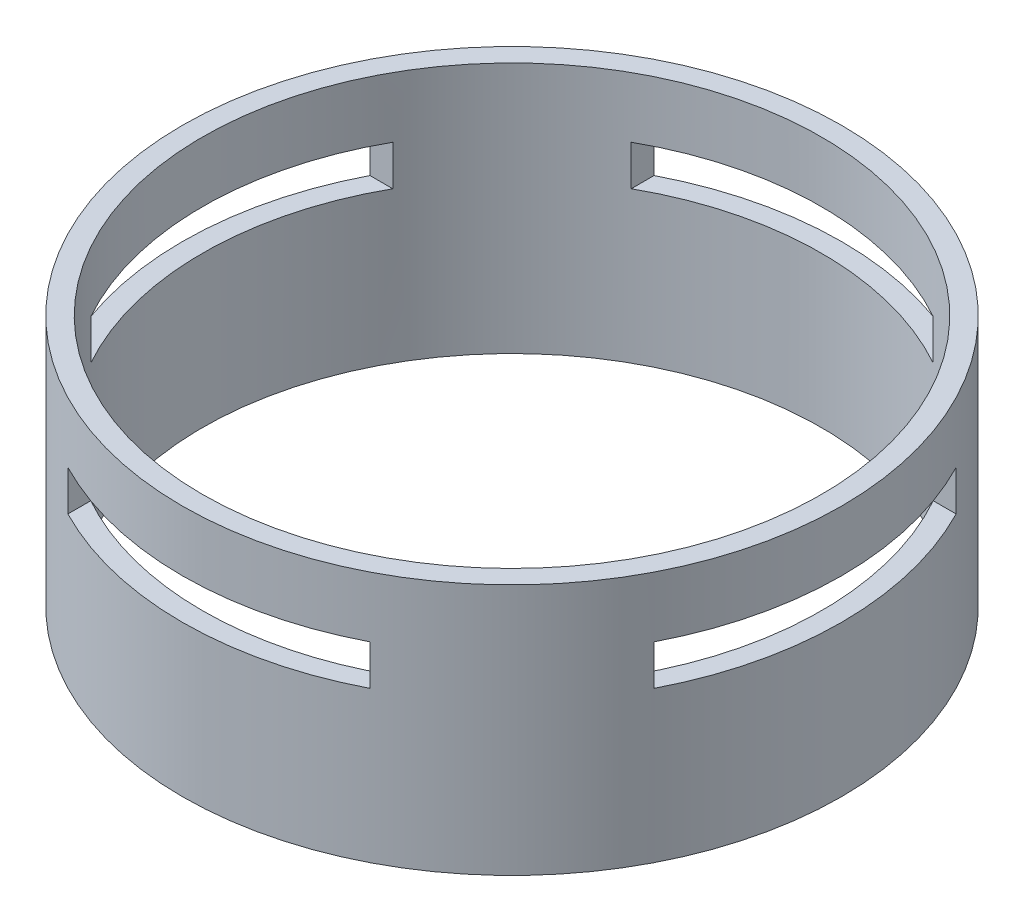
ISO-10303-21;
HEADER;
FILE_DESCRIPTION(('STEP AP214'),'2;1');
FILE_NAME('part.step','',(''),(''),'','','');
FILE_SCHEMA(('AUTOMOTIVE_DESIGN { 1 0 10303 214 1 1 1 1 }'));
ENDSEC;
DATA;
#1=APPLICATION_CONTEXT('core data for automotive mechanical design processes');
#2=APPLICATION_PROTOCOL_DEFINITION('international standard','automotive_design',2000,#1);
#3=PRODUCT_CONTEXT('',#1,'mechanical');
#4=PRODUCT('Part','Part','',(#3));
#5=PRODUCT_RELATED_PRODUCT_CATEGORY('part','',(#4));
#6=PRODUCT_DEFINITION_FORMATION('','',#4);
#7=PRODUCT_DEFINITION_CONTEXT('part definition',#1,'design');
#8=PRODUCT_DEFINITION('design','',#6,#7);
#9=PRODUCT_DEFINITION_SHAPE('','',#8);
#10=(LENGTH_UNIT() NAMED_UNIT(*) SI_UNIT(.MILLI.,.METRE.));
#11=(NAMED_UNIT(*) PLANE_ANGLE_UNIT() SI_UNIT($,.RADIAN.));
#12=(NAMED_UNIT(*) SI_UNIT($,.STERADIAN.) SOLID_ANGLE_UNIT());
#13=UNCERTAINTY_MEASURE_WITH_UNIT(LENGTH_MEASURE(1.E-05),#10,'distance_accuracy_value','');
#14=(GEOMETRIC_REPRESENTATION_CONTEXT(3) GLOBAL_UNCERTAINTY_ASSIGNED_CONTEXT((#13)) GLOBAL_UNIT_ASSIGNED_CONTEXT((#10,
#11,#12)) REPRESENTATION_CONTEXT('',''));
#15=CARTESIAN_POINT('',(0.,0.,0.));
#16=DIRECTION('',(0.,0.,1.));
#17=DIRECTION('',(1.,0.,0.));
#18=AXIS2_PLACEMENT_3D('',#15,#16,#17);
#19=CARTESIAN_POINT('',(0.,25.,0.));
#20=DIRECTION('',(0.,1.,0.));
#21=DIRECTION('',(0.,0.,1.));
#22=AXIS2_PLACEMENT_3D('',#19,#20,#21);
#23=PLANE('',#22);
#24=CARTESIAN_POINT('',(0.,25.,0.));
#25=DIRECTION('',(0.,1.,0.));
#26=DIRECTION('',(0.,0.,1.));
#27=AXIS2_PLACEMENT_3D('',#24,#25,#26);
#28=CIRCLE('',#27,32.75);
#29=CARTESIAN_POINT('',(0.,25.,32.75));
#30=VERTEX_POINT('',#29);
#31=EDGE_CURVE('E274',#30,#30,#28,.T.);
#32=ORIENTED_EDGE('',*,*,#31,.T.);
#33=EDGE_LOOP('',(#32));
#34=FACE_BOUND('',#33,.T.);
#35=CARTESIAN_POINT('',(0.,25.,0.));
#36=DIRECTION('',(0.,1.,0.));
#37=DIRECTION('',(0.,0.,1.));
#38=AXIS2_PLACEMENT_3D('',#35,#36,#37);
#39=CIRCLE('',#38,30.75);
#40=CARTESIAN_POINT('',(0.,25.,30.75));
#41=VERTEX_POINT('',#40);
#42=EDGE_CURVE('E268',#41,#41,#39,.T.);
#43=ORIENTED_EDGE('',*,*,#42,.F.);
#44=EDGE_LOOP('',(#43));
#45=FACE_BOUND('',#44,.T.);
#46=ADVANCED_FACE('F33',(#34,#45),#23,.T.);
#47=CARTESIAN_POINT('',(0.,0.,0.));
#48=DIRECTION('',(0.,1.,0.));
#49=DIRECTION('',(0.,0.,1.));
#50=AXIS2_PLACEMENT_3D('',#47,#48,#49);
#51=PLANE('',#50);
#52=CARTESIAN_POINT('',(0.,0.,0.));
#53=DIRECTION('',(0.,1.,0.));
#54=DIRECTION('',(0.,0.,1.));
#55=AXIS2_PLACEMENT_3D('',#52,#53,#54);
#56=CIRCLE('',#55,32.75);
#57=CARTESIAN_POINT('',(0.,0.,32.75));
#58=VERTEX_POINT('',#57);
#59=EDGE_CURVE('E271',#58,#58,#56,.T.);
#60=ORIENTED_EDGE('',*,*,#59,.F.);
#61=EDGE_LOOP('',(#60));
#62=FACE_BOUND('',#61,.T.);
#63=CARTESIAN_POINT('',(0.,0.,0.));
#64=DIRECTION('',(0.,1.,0.));
#65=DIRECTION('',(0.,0.,1.));
#66=AXIS2_PLACEMENT_3D('',#63,#64,#65);
#67=CIRCLE('',#66,30.75);
#68=CARTESIAN_POINT('',(0.,0.,30.75));
#69=VERTEX_POINT('',#68);
#70=EDGE_CURVE('E267',#69,#69,#67,.T.);
#71=ORIENTED_EDGE('',*,*,#70,.T.);
#72=EDGE_LOOP('',(#71));
#73=FACE_BOUND('',#72,.T.);
#74=ADVANCED_FACE('F317',(#62,#73),#51,.F.);
#75=CARTESIAN_POINT('',(0.,25.,0.));
#76=DIRECTION('',(0.,-1.,0.));
#77=DIRECTION('',(0.,0.,-1.));
#78=AXIS2_PLACEMENT_3D('',#75,#76,#77);
#79=CYLINDRICAL_SURFACE('',#78,32.75);
#80=DIRECTION('',(0.,-1.,0.));
#81=VECTOR('',#80,1.);
#82=CARTESIAN_POINT('',(29.1129266821459,25.,-14.9999999999999));
#83=LINE('',#82,#81);
#84=CARTESIAN_POINT('',(29.1129266821459,19.,-14.9999999999999));
#85=VERTEX_POINT('',#84);
#86=CARTESIAN_POINT('',(29.1129266821459,15.,-14.9999999999999));
#87=VERTEX_POINT('',#86);
#88=EDGE_CURVE('E210',#85,#87,#83,.T.);
#89=ORIENTED_EDGE('',*,*,#88,.T.);
#90=CARTESIAN_POINT('',(0.,15.,0.));
#91=DIRECTION('',(0.,-1.,0.));
#92=DIRECTION('',(0.,0.,-1.));
#93=AXIS2_PLACEMENT_3D('',#90,#91,#92);
#94=CIRCLE('',#93,32.75);
#95=CARTESIAN_POINT('',(29.1129266821458,15.,15.0000000000001));
#96=VERTEX_POINT('',#95);
#97=EDGE_CURVE('E48',#87,#96,#94,.T.);
#98=ORIENTED_EDGE('',*,*,#97,.T.);
#99=DIRECTION('',(0.,-1.,0.));
#100=VECTOR('',#99,1.);
#101=CARTESIAN_POINT('',(29.1129266821458,25.,15.0000000000001));
#102=LINE('',#101,#100);
#103=CARTESIAN_POINT('',(29.1129266821458,19.,15.0000000000001));
#104=VERTEX_POINT('',#103);
#105=EDGE_CURVE('E221',#96,#104,#102,.F.);
#106=ORIENTED_EDGE('',*,*,#105,.T.);
#107=CARTESIAN_POINT('',(0.,19.,0.));
#108=DIRECTION('',(0.,1.,0.));
#109=DIRECTION('',(0.,0.,1.));
#110=AXIS2_PLACEMENT_3D('',#107,#108,#109);
#111=CIRCLE('',#110,32.75);
#112=EDGE_CURVE('E241',#104,#85,#111,.T.);
#113=ORIENTED_EDGE('',*,*,#112,.T.);
#114=EDGE_LOOP('',(#89,#98,#106,#113));
#115=FACE_BOUND('',#114,.T.);
#116=CARTESIAN_POINT('',(-15.,19.,29.1129266821459));
#117=VERTEX_POINT('',#116);
#118=CARTESIAN_POINT('',(15.,19.,29.1129266821459));
#119=VERTEX_POINT('',#118);
#120=EDGE_CURVE('E238',#117,#119,#111,.T.);
#121=ORIENTED_EDGE('',*,*,#120,.T.);
#122=DIRECTION('',(0.,-1.,0.));
#123=VECTOR('',#122,1.);
#124=CARTESIAN_POINT('',(15.,25.,29.1129266821459));
#125=LINE('',#124,#123);
#126=CARTESIAN_POINT('',(15.,15.,29.1129266821459));
#127=VERTEX_POINT('',#126);
#128=EDGE_CURVE('E232',#119,#127,#125,.T.);
#129=ORIENTED_EDGE('',*,*,#128,.T.);
#130=CARTESIAN_POINT('',(-15.,15.,29.1129266821459));
#131=VERTEX_POINT('',#130);
#132=EDGE_CURVE('E236',#127,#131,#94,.T.);
#133=ORIENTED_EDGE('',*,*,#132,.T.);
#134=DIRECTION('',(0.,-1.,0.));
#135=VECTOR('',#134,1.);
#136=CARTESIAN_POINT('',(-15.,25.,29.1129266821459));
#137=LINE('',#136,#135);
#138=EDGE_CURVE('E229',#131,#117,#137,.F.);
#139=ORIENTED_EDGE('',*,*,#138,.T.);
#140=EDGE_LOOP('',(#121,#129,#133,#139));
#141=FACE_BOUND('',#140,.T.);
#142=DIRECTION('',(0.,-1.,0.));
#143=VECTOR('',#142,1.);
#144=CARTESIAN_POINT('',(-29.1129266821458,25.,-15.0000000000001));
#145=LINE('',#144,#143);
#146=CARTESIAN_POINT('',(-29.1129266821458,15.,-15.0000000000001));
#147=VERTEX_POINT('',#146);
#148=CARTESIAN_POINT('',(-29.1129266821458,19.,-15.0000000000001));
#149=VERTEX_POINT('',#148);
#150=EDGE_CURVE('E242',#147,#149,#145,.F.);
#151=ORIENTED_EDGE('',*,*,#150,.T.);
#152=CARTESIAN_POINT('',(-29.112926682146,19.,14.9999999999997));
#153=VERTEX_POINT('',#152);
#154=EDGE_CURVE('E240',#149,#153,#111,.T.);
#155=ORIENTED_EDGE('',*,*,#154,.T.);
#156=DIRECTION('',(0.,-1.,0.));
#157=VECTOR('',#156,1.);
#158=CARTESIAN_POINT('',(-29.112926682146,25.,14.9999999999997));
#159=LINE('',#158,#157);
#160=CARTESIAN_POINT('',(-29.112926682146,15.,14.9999999999997));
#161=VERTEX_POINT('',#160);
#162=EDGE_CURVE('E211',#153,#161,#159,.T.);
#163=ORIENTED_EDGE('',*,*,#162,.T.);
#164=EDGE_CURVE('E166',#161,#147,#94,.T.);
#165=ORIENTED_EDGE('',*,*,#164,.T.);
#166=EDGE_LOOP('',(#151,#155,#163,#165));
#167=FACE_BOUND('',#166,.T.);
#168=DIRECTION('',(0.,-1.,0.));
#169=VECTOR('',#168,1.);
#170=CARTESIAN_POINT('',(15.,25.,-29.1129266821459));
#171=LINE('',#170,#169);
#172=CARTESIAN_POINT('',(15.,15.,-29.1129266821459));
#173=VERTEX_POINT('',#172);
#174=CARTESIAN_POINT('',(15.,19.,-29.1129266821459));
#175=VERTEX_POINT('',#174);
#176=EDGE_CURVE('E259',#173,#175,#171,.F.);
#177=ORIENTED_EDGE('',*,*,#176,.T.);
#178=CARTESIAN_POINT('',(0.,19.,0.));
#179=DIRECTION('',(0.,1.,0.));
#180=DIRECTION('',(-1.,0.,0.));
#181=AXIS2_PLACEMENT_3D('',#178,#179,#180);
#182=CIRCLE('',#181,32.75);
#183=CARTESIAN_POINT('',(-15.,19.,-29.1129266821459));
#184=VERTEX_POINT('',#183);
#185=EDGE_CURVE('E262',#175,#184,#182,.T.);
#186=ORIENTED_EDGE('',*,*,#185,.T.);
#187=DIRECTION('',(0.,-1.,0.));
#188=VECTOR('',#187,1.);
#189=CARTESIAN_POINT('',(-15.,25.,-29.1129266821459));
#190=LINE('',#189,#188);
#191=CARTESIAN_POINT('',(-15.,15.,-29.1129266821459));
#192=VERTEX_POINT('',#191);
#193=EDGE_CURVE('E264',#184,#192,#190,.T.);
#194=ORIENTED_EDGE('',*,*,#193,.T.);
#195=CARTESIAN_POINT('',(0.,15.,0.));
#196=DIRECTION('',(0.,-1.,0.));
#197=DIRECTION('',(0.,0.,-1.));
#198=AXIS2_PLACEMENT_3D('',#195,#196,#197);
#199=CIRCLE('',#198,32.75);
#200=EDGE_CURVE('E250',#192,#173,#199,.T.);
#201=ORIENTED_EDGE('',*,*,#200,.T.);
#202=EDGE_LOOP('',(#177,#186,#194,#201));
#203=FACE_BOUND('',#202,.T.);
#204=ORIENTED_EDGE('',*,*,#31,.F.);
#205=EDGE_LOOP('',(#204));
#206=FACE_BOUND('',#205,.T.);
#207=ORIENTED_EDGE('',*,*,#59,.T.);
#208=EDGE_LOOP('',(#207));
#209=FACE_BOUND('',#208,.T.);
#210=ADVANCED_FACE('F35',(#115,#141,#167,#203,#206,#209),#79,.T.);
#211=CARTESIAN_POINT('',(0.,25.,0.));
#212=DIRECTION('',(0.,-1.,0.));
#213=DIRECTION('',(0.,0.,-1.));
#214=AXIS2_PLACEMENT_3D('',#211,#212,#213);
#215=CYLINDRICAL_SURFACE('',#214,30.75);
#216=DIRECTION('',(0.,-1.,0.));
#217=VECTOR('',#216,1.);
#218=CARTESIAN_POINT('',(26.84329525226,25.,-14.9999999999999));
#219=LINE('',#218,#217);
#220=CARTESIAN_POINT('',(26.84329525226,19.,-14.9999999999999));
#221=VERTEX_POINT('',#220);
#222=CARTESIAN_POINT('',(26.84329525226,15.,-14.9999999999999));
#223=VERTEX_POINT('',#222);
#224=EDGE_CURVE('E11',#221,#223,#219,.T.);
#225=ORIENTED_EDGE('',*,*,#224,.F.);
#226=CARTESIAN_POINT('',(0.,19.,0.));
#227=DIRECTION('',(0.,1.,0.));
#228=DIRECTION('',(0.,0.,1.));
#229=AXIS2_PLACEMENT_3D('',#226,#227,#228);
#230=CIRCLE('',#229,30.75);
#231=CARTESIAN_POINT('',(26.8432952522599,19.,15.0000000000001));
#232=VERTEX_POINT('',#231);
#233=EDGE_CURVE('E41',#232,#221,#230,.T.);
#234=ORIENTED_EDGE('',*,*,#233,.F.);
#235=DIRECTION('',(0.,-1.,0.));
#236=VECTOR('',#235,1.);
#237=CARTESIAN_POINT('',(26.8432952522599,25.,15.0000000000001));
#238=LINE('',#237,#236);
#239=CARTESIAN_POINT('',(26.8432952522599,15.,15.0000000000001));
#240=VERTEX_POINT('',#239);
#241=EDGE_CURVE('E179',#240,#232,#238,.F.);
#242=ORIENTED_EDGE('',*,*,#241,.F.);
#243=CARTESIAN_POINT('',(0.,15.,0.));
#244=DIRECTION('',(0.,-1.,0.));
#245=DIRECTION('',(0.,0.,-1.));
#246=AXIS2_PLACEMENT_3D('',#243,#244,#245);
#247=CIRCLE('',#246,30.75);
#248=EDGE_CURVE('E175',#223,#240,#247,.T.);
#249=ORIENTED_EDGE('',*,*,#248,.F.);
#250=EDGE_LOOP('',(#225,#234,#242,#249));
#251=FACE_BOUND('',#250,.T.);
#252=DIRECTION('',(0.,-1.,0.));
#253=VECTOR('',#252,1.);
#254=CARTESIAN_POINT('',(15.,25.,26.8432952522599));
#255=LINE('',#254,#253);
#256=CARTESIAN_POINT('',(15.,19.,26.8432952522599));
#257=VERTEX_POINT('',#256);
#258=CARTESIAN_POINT('',(15.,15.,26.8432952522599));
#259=VERTEX_POINT('',#258);
#260=EDGE_CURVE('E180',#257,#259,#255,.T.);
#261=ORIENTED_EDGE('',*,*,#260,.F.);
#262=CARTESIAN_POINT('',(-15.,19.,26.8432952522599));
#263=VERTEX_POINT('',#262);
#264=EDGE_CURVE('E178',#263,#257,#230,.T.);
#265=ORIENTED_EDGE('',*,*,#264,.F.);
#266=DIRECTION('',(0.,-1.,0.));
#267=VECTOR('',#266,1.);
#268=CARTESIAN_POINT('',(-15.,25.,26.8432952522599));
#269=LINE('',#268,#267);
#270=CARTESIAN_POINT('',(-15.,15.,26.8432952522599));
#271=VERTEX_POINT('',#270);
#272=EDGE_CURVE('E182',#271,#263,#269,.F.);
#273=ORIENTED_EDGE('',*,*,#272,.F.);
#274=EDGE_CURVE('E176',#259,#271,#247,.T.);
#275=ORIENTED_EDGE('',*,*,#274,.F.);
#276=EDGE_LOOP('',(#261,#265,#273,#275));
#277=FACE_BOUND('',#276,.T.);
#278=DIRECTION('',(0.,-1.,0.));
#279=VECTOR('',#278,1.);
#280=CARTESIAN_POINT('',(-26.8432952522599,25.,-15.0000000000001));
#281=LINE('',#280,#279);
#282=CARTESIAN_POINT('',(-26.8432952522599,15.,-15.0000000000001));
#283=VERTEX_POINT('',#282);
#284=CARTESIAN_POINT('',(-26.8432952522599,19.,-15.0000000000001));
#285=VERTEX_POINT('',#284);
#286=EDGE_CURVE('E172',#283,#285,#281,.F.);
#287=ORIENTED_EDGE('',*,*,#286,.F.);
#288=CARTESIAN_POINT('',(-26.8432952522601,15.,14.9999999999997));
#289=VERTEX_POINT('',#288);
#290=EDGE_CURVE('E159',#289,#283,#247,.T.);
#291=ORIENTED_EDGE('',*,*,#290,.F.);
#292=DIRECTION('',(0.,-1.,0.));
#293=VECTOR('',#292,1.);
#294=CARTESIAN_POINT('',(-26.8432952522601,25.,14.9999999999997));
#295=LINE('',#294,#293);
#296=CARTESIAN_POINT('',(-26.8432952522601,19.,14.9999999999997));
#297=VERTEX_POINT('',#296);
#298=EDGE_CURVE('E147',#297,#289,#295,.T.);
#299=ORIENTED_EDGE('',*,*,#298,.F.);
#300=EDGE_CURVE('E173',#285,#297,#230,.T.);
#301=ORIENTED_EDGE('',*,*,#300,.F.);
#302=EDGE_LOOP('',(#287,#291,#299,#301));
#303=FACE_BOUND('',#302,.T.);
#304=DIRECTION('',(0.,-1.,0.));
#305=VECTOR('',#304,1.);
#306=CARTESIAN_POINT('',(-15.,25.,-26.8432952522599));
#307=LINE('',#306,#305);
#308=CARTESIAN_POINT('',(-15.,19.,-26.8432952522599));
#309=VERTEX_POINT('',#308);
#310=CARTESIAN_POINT('',(-15.,15.,-26.8432952522599));
#311=VERTEX_POINT('',#310);
#312=EDGE_CURVE('E160',#309,#311,#307,.T.);
#313=ORIENTED_EDGE('',*,*,#312,.F.);
#314=CARTESIAN_POINT('',(0.,19.,0.));
#315=DIRECTION('',(0.,1.,0.));
#316=DIRECTION('',(-1.,0.,0.));
#317=AXIS2_PLACEMENT_3D('',#314,#315,#316);
#318=CIRCLE('',#317,30.75);
#319=CARTESIAN_POINT('',(15.,19.,-26.8432952522599));
#320=VERTEX_POINT('',#319);
#321=EDGE_CURVE('E283',#320,#309,#318,.T.);
#322=ORIENTED_EDGE('',*,*,#321,.F.);
#323=DIRECTION('',(0.,-1.,0.));
#324=VECTOR('',#323,1.);
#325=CARTESIAN_POINT('',(15.,25.,-26.8432952522599));
#326=LINE('',#325,#324);
#327=CARTESIAN_POINT('',(15.,15.,-26.8432952522599));
#328=VERTEX_POINT('',#327);
#329=EDGE_CURVE('E281',#328,#320,#326,.F.);
#330=ORIENTED_EDGE('',*,*,#329,.F.);
#331=CARTESIAN_POINT('',(0.,15.,0.));
#332=DIRECTION('',(0.,-1.,0.));
#333=DIRECTION('',(0.,0.,-1.));
#334=AXIS2_PLACEMENT_3D('',#331,#332,#333);
#335=CIRCLE('',#334,30.75);
#336=EDGE_CURVE('E277',#311,#328,#335,.T.);
#337=ORIENTED_EDGE('',*,*,#336,.F.);
#338=EDGE_LOOP('',(#313,#322,#330,#337));
#339=FACE_BOUND('',#338,.T.);
#340=ORIENTED_EDGE('',*,*,#42,.T.);
#341=EDGE_LOOP('',(#340));
#342=FACE_BOUND('',#341,.T.);
#343=ORIENTED_EDGE('',*,*,#70,.F.);
#344=EDGE_LOOP('',(#343));
#345=FACE_BOUND('',#344,.T.);
#346=ADVANCED_FACE('F170',(#251,#277,#303,#339,#342,#345),#215,.F.);
#347=CARTESIAN_POINT('',(-15.,19.,-32.75));
#348=DIRECTION('',(-1.,0.,0.));
#349=DIRECTION('',(0.,0.,1.));
#350=AXIS2_PLACEMENT_3D('',#347,#348,#349);
#351=PLANE('',#350);
#352=DIRECTION('',(0.,0.,1.));
#353=VECTOR('',#352,1.);
#354=CARTESIAN_POINT('',(-15.,19.,-32.75));
#355=LINE('',#354,#353);
#356=EDGE_CURVE('E247',#184,#309,#355,.T.);
#357=ORIENTED_EDGE('',*,*,#356,.T.);
#358=ORIENTED_EDGE('',*,*,#312,.T.);
#359=DIRECTION('',(0.,0.,1.));
#360=VECTOR('',#359,1.);
#361=CARTESIAN_POINT('',(-15.,15.,-32.75));
#362=LINE('',#361,#360);
#363=EDGE_CURVE('E246',#192,#311,#362,.T.);
#364=ORIENTED_EDGE('',*,*,#363,.F.);
#365=ORIENTED_EDGE('',*,*,#193,.F.);
#366=EDGE_LOOP('',(#357,#358,#364,#365));
#367=FACE_BOUND('',#366,.T.);
#368=ADVANCED_FACE('F290',(#367),#351,.F.);
#369=CARTESIAN_POINT('',(-15.,19.,-32.75));
#370=DIRECTION('',(0.,1.,0.));
#371=DIRECTION('',(-1.,0.,0.));
#372=AXIS2_PLACEMENT_3D('',#369,#370,#371);
#373=PLANE('',#372);
#374=DIRECTION('',(0.,0.,1.));
#375=VECTOR('',#374,1.);
#376=CARTESIAN_POINT('',(15.,19.,-32.75));
#377=LINE('',#376,#375);
#378=EDGE_CURVE('E251',#175,#320,#377,.T.);
#379=ORIENTED_EDGE('',*,*,#378,.T.);
#380=ORIENTED_EDGE('',*,*,#321,.T.);
#381=ORIENTED_EDGE('',*,*,#356,.F.);
#382=ORIENTED_EDGE('',*,*,#185,.F.);
#383=EDGE_LOOP('',(#379,#380,#381,#382));
#384=FACE_BOUND('',#383,.T.);
#385=ADVANCED_FACE('F306',(#384),#373,.F.);
#386=CARTESIAN_POINT('',(15.,19.,-32.75));
#387=DIRECTION('',(1.,0.,0.));
#388=DIRECTION('',(0.,1.,0.));
#389=AXIS2_PLACEMENT_3D('',#386,#387,#388);
#390=PLANE('',#389);
#391=DIRECTION('',(0.,0.,1.));
#392=VECTOR('',#391,1.);
#393=CARTESIAN_POINT('',(15.,15.,-32.75));
#394=LINE('',#393,#392);
#395=EDGE_CURVE('E254',#173,#328,#394,.T.);
#396=ORIENTED_EDGE('',*,*,#395,.T.);
#397=ORIENTED_EDGE('',*,*,#329,.T.);
#398=ORIENTED_EDGE('',*,*,#378,.F.);
#399=ORIENTED_EDGE('',*,*,#176,.F.);
#400=EDGE_LOOP('',(#396,#397,#398,#399));
#401=FACE_BOUND('',#400,.T.);
#402=ADVANCED_FACE('F301',(#401),#390,.F.);
#403=CARTESIAN_POINT('',(-15.,15.,-32.75));
#404=DIRECTION('',(0.,-1.,0.));
#405=DIRECTION('',(0.,0.,-1.));
#406=AXIS2_PLACEMENT_3D('',#403,#404,#405);
#407=PLANE('',#406);
#408=ORIENTED_EDGE('',*,*,#200,.F.);
#409=ORIENTED_EDGE('',*,*,#363,.T.);
#410=ORIENTED_EDGE('',*,*,#336,.T.);
#411=ORIENTED_EDGE('',*,*,#395,.F.);
#412=EDGE_LOOP('',(#408,#409,#410,#411));
#413=FACE_BOUND('',#412,.T.);
#414=ADVANCED_FACE('F298',(#413),#407,.F.);
#415=CARTESIAN_POINT('',(-32.7500000000005,19.,14.9999999999997));
#416=DIRECTION('',(0.,0.,1.));
#417=DIRECTION('',(1.,0.,0.));
#418=AXIS2_PLACEMENT_3D('',#415,#416,#417);
#419=PLANE('',#418);
#420=DIRECTION('',(1.,0.,0.));
#421=VECTOR('',#420,1.);
#422=CARTESIAN_POINT('',(-32.7500000000005,19.,14.9999999999997));
#423=LINE('',#422,#421);
#424=EDGE_CURVE('E154',#153,#297,#423,.T.);
#425=ORIENTED_EDGE('',*,*,#424,.T.);
#426=ORIENTED_EDGE('',*,*,#298,.T.);
#427=DIRECTION('',(1.,0.,0.));
#428=VECTOR('',#427,1.);
#429=CARTESIAN_POINT('',(-32.7500000000005,15.,14.9999999999997));
#430=LINE('',#429,#428);
#431=EDGE_CURVE('E151',#161,#289,#430,.T.);
#432=ORIENTED_EDGE('',*,*,#431,.F.);
#433=ORIENTED_EDGE('',*,*,#162,.F.);
#434=EDGE_LOOP('',(#425,#426,#432,#433));
#435=FACE_BOUND('',#434,.T.);
#436=ADVANCED_FACE('F149',(#435),#419,.F.);
#437=CARTESIAN_POINT('',(32.7500000000002,15.,-14.9999999999999));
#438=DIRECTION('',(0.,-1.,0.));
#439=DIRECTION('',(0.,0.,-1.));
#440=AXIS2_PLACEMENT_3D('',#437,#438,#439);
#441=PLANE('',#440);
#442=ORIENTED_EDGE('',*,*,#431,.T.);
#443=ORIENTED_EDGE('',*,*,#290,.T.);
#444=DIRECTION('',(-1.,0.,0.));
#445=VECTOR('',#444,1.);
#446=CARTESIAN_POINT('',(32.7500000000002,15.,-14.9999999999999));
#447=LINE('',#446,#445);
#448=EDGE_CURVE('E224',#283,#147,#447,.T.);
#449=ORIENTED_EDGE('',*,*,#448,.T.);
#450=ORIENTED_EDGE('',*,*,#164,.F.);
#451=EDGE_LOOP('',(#442,#443,#449,#450));
#452=FACE_BOUND('',#451,.T.);
#453=ADVANCED_FACE('F163',(#452),#441,.F.);
#454=CARTESIAN_POINT('',(32.7500000000002,19.,-14.9999999999999));
#455=DIRECTION('',(0.,1.,0.));
#456=DIRECTION('',(0.,0.,1.));
#457=AXIS2_PLACEMENT_3D('',#454,#455,#456);
#458=PLANE('',#457);
#459=DIRECTION('',(-1.,0.,0.));
#460=VECTOR('',#459,1.);
#461=CARTESIAN_POINT('',(32.7500000000002,19.,-14.9999999999999));
#462=LINE('',#461,#460);
#463=EDGE_CURVE('E212',#285,#149,#462,.T.);
#464=ORIENTED_EDGE('',*,*,#463,.F.);
#465=ORIENTED_EDGE('',*,*,#300,.T.);
#466=ORIENTED_EDGE('',*,*,#424,.F.);
#467=ORIENTED_EDGE('',*,*,#154,.F.);
#468=EDGE_LOOP('',(#464,#465,#466,#467));
#469=FACE_BOUND('',#468,.T.);
#470=ADVANCED_FACE('F336',(#469),#458,.F.);
#471=CARTESIAN_POINT('',(32.7500000000002,19.,-14.9999999999999));
#472=DIRECTION('',(0.,0.,-1.));
#473=DIRECTION('',(-1.,0.,0.));
#474=AXIS2_PLACEMENT_3D('',#471,#472,#473);
#475=PLANE('',#474);
#476=ORIENTED_EDGE('',*,*,#448,.F.);
#477=ORIENTED_EDGE('',*,*,#286,.T.);
#478=ORIENTED_EDGE('',*,*,#463,.T.);
#479=ORIENTED_EDGE('',*,*,#150,.F.);
#480=EDGE_LOOP('',(#476,#477,#478,#479));
#481=FACE_BOUND('',#480,.T.);
#482=ADVANCED_FACE('F344',(#481),#475,.F.);
#483=CARTESIAN_POINT('',(-15.,19.,32.75));
#484=DIRECTION('',(-1.,0.,0.));
#485=DIRECTION('',(0.,-1.,0.));
#486=AXIS2_PLACEMENT_3D('',#483,#484,#485);
#487=PLANE('',#486);
#488=DIRECTION('',(0.,0.,-1.));
#489=VECTOR('',#488,1.);
#490=CARTESIAN_POINT('',(-15.,15.,32.75));
#491=LINE('',#490,#489);
#492=EDGE_CURVE('E371',#131,#271,#491,.T.);
#493=ORIENTED_EDGE('',*,*,#492,.T.);
#494=ORIENTED_EDGE('',*,*,#272,.T.);
#495=DIRECTION('',(0.,0.,-1.));
#496=VECTOR('',#495,1.);
#497=CARTESIAN_POINT('',(-15.,19.,32.75));
#498=LINE('',#497,#496);
#499=EDGE_CURVE('E56',#117,#263,#498,.T.);
#500=ORIENTED_EDGE('',*,*,#499,.F.);
#501=ORIENTED_EDGE('',*,*,#138,.F.);
#502=EDGE_LOOP('',(#493,#494,#500,#501));
#503=FACE_BOUND('',#502,.T.);
#504=ADVANCED_FACE('F340',(#503),#487,.F.);
#505=CARTESIAN_POINT('',(15.,19.,32.75));
#506=DIRECTION('',(1.,0.,0.));
#507=DIRECTION('',(0.,0.,-1.));
#508=AXIS2_PLACEMENT_3D('',#505,#506,#507);
#509=PLANE('',#508);
#510=DIRECTION('',(0.,0.,-1.));
#511=VECTOR('',#510,1.);
#512=CARTESIAN_POINT('',(15.,19.,32.75));
#513=LINE('',#512,#511);
#514=EDGE_CURVE('E227',#119,#257,#513,.T.);
#515=ORIENTED_EDGE('',*,*,#514,.T.);
#516=ORIENTED_EDGE('',*,*,#260,.T.);
#517=DIRECTION('',(0.,0.,-1.));
#518=VECTOR('',#517,1.);
#519=CARTESIAN_POINT('',(15.,15.,32.75));
#520=LINE('',#519,#518);
#521=EDGE_CURVE('E372',#127,#259,#520,.T.);
#522=ORIENTED_EDGE('',*,*,#521,.F.);
#523=ORIENTED_EDGE('',*,*,#128,.F.);
#524=EDGE_LOOP('',(#515,#516,#522,#523));
#525=FACE_BOUND('',#524,.T.);
#526=ADVANCED_FACE('F343',(#525),#509,.F.);
#527=ORIENTED_EDGE('',*,*,#521,.T.);
#528=ORIENTED_EDGE('',*,*,#274,.T.);
#529=ORIENTED_EDGE('',*,*,#492,.F.);
#530=ORIENTED_EDGE('',*,*,#132,.F.);
#531=EDGE_LOOP('',(#527,#528,#529,#530));
#532=FACE_BOUND('',#531,.T.);
#533=ADVANCED_FACE('F338',(#532),#441,.F.);
#534=ORIENTED_EDGE('',*,*,#120,.F.);
#535=ORIENTED_EDGE('',*,*,#499,.T.);
#536=ORIENTED_EDGE('',*,*,#264,.T.);
#537=ORIENTED_EDGE('',*,*,#514,.F.);
#538=EDGE_LOOP('',(#534,#535,#536,#537));
#539=FACE_BOUND('',#538,.T.);
#540=ADVANCED_FACE('F350',(#539),#458,.F.);
#541=EDGE_CURVE('E201',#85,#221,#462,.T.);
#542=ORIENTED_EDGE('',*,*,#541,.T.);
#543=ORIENTED_EDGE('',*,*,#224,.T.);
#544=EDGE_CURVE('E219',#87,#223,#447,.T.);
#545=ORIENTED_EDGE('',*,*,#544,.F.);
#546=ORIENTED_EDGE('',*,*,#88,.F.);
#547=EDGE_LOOP('',(#542,#543,#545,#546));
#548=FACE_BOUND('',#547,.T.);
#549=ADVANCED_FACE('F207',(#548),#475,.F.);
#550=DIRECTION('',(-1.,0.,0.));
#551=VECTOR('',#550,1.);
#552=CARTESIAN_POINT('',(32.7500000000001,19.,15.0000000000001));
#553=LINE('',#552,#551);
#554=EDGE_CURVE('E202',#104,#232,#553,.T.);
#555=ORIENTED_EDGE('',*,*,#554,.T.);
#556=ORIENTED_EDGE('',*,*,#233,.T.);
#557=ORIENTED_EDGE('',*,*,#541,.F.);
#558=ORIENTED_EDGE('',*,*,#112,.F.);
#559=EDGE_LOOP('',(#555,#556,#557,#558));
#560=FACE_BOUND('',#559,.T.);
#561=ADVANCED_FACE('F200',(#560),#458,.F.);
#562=CARTESIAN_POINT('',(32.7500000000001,19.,15.0000000000001));
#563=DIRECTION('',(0.,0.,1.));
#564=DIRECTION('',(1.,0.,0.));
#565=AXIS2_PLACEMENT_3D('',#562,#563,#564);
#566=PLANE('',#565);
#567=DIRECTION('',(-1.,0.,0.));
#568=VECTOR('',#567,1.);
#569=CARTESIAN_POINT('',(32.7500000000001,15.,15.0000000000001));
#570=LINE('',#569,#568);
#571=EDGE_CURVE('E217',#96,#240,#570,.T.);
#572=ORIENTED_EDGE('',*,*,#571,.T.);
#573=ORIENTED_EDGE('',*,*,#241,.T.);
#574=ORIENTED_EDGE('',*,*,#554,.F.);
#575=ORIENTED_EDGE('',*,*,#105,.F.);
#576=EDGE_LOOP('',(#572,#573,#574,#575));
#577=FACE_BOUND('',#576,.T.);
#578=ADVANCED_FACE('F220',(#577),#566,.F.);
#579=ORIENTED_EDGE('',*,*,#544,.T.);
#580=ORIENTED_EDGE('',*,*,#248,.T.);
#581=ORIENTED_EDGE('',*,*,#571,.F.);
#582=ORIENTED_EDGE('',*,*,#97,.F.);
#583=EDGE_LOOP('',(#579,#580,#581,#582));
#584=FACE_BOUND('',#583,.T.);
#585=ADVANCED_FACE('F216',(#584),#441,.F.);
#586=CLOSED_SHELL('',(#46,#74,#210,#346,#368,#385,#402,#414,#436,#453,#470,#482,#504,#526,#533,
#540,#549,#561,#578,#585));
#587=MANIFOLD_SOLID_BREP('B2',#586);
#588=ADVANCED_BREP_SHAPE_REPRESENTATION('',(#18,#587),#14);
#589=SHAPE_DEFINITION_REPRESENTATION(#9,#588);
ENDSEC;
END-ISO-10303-21;
